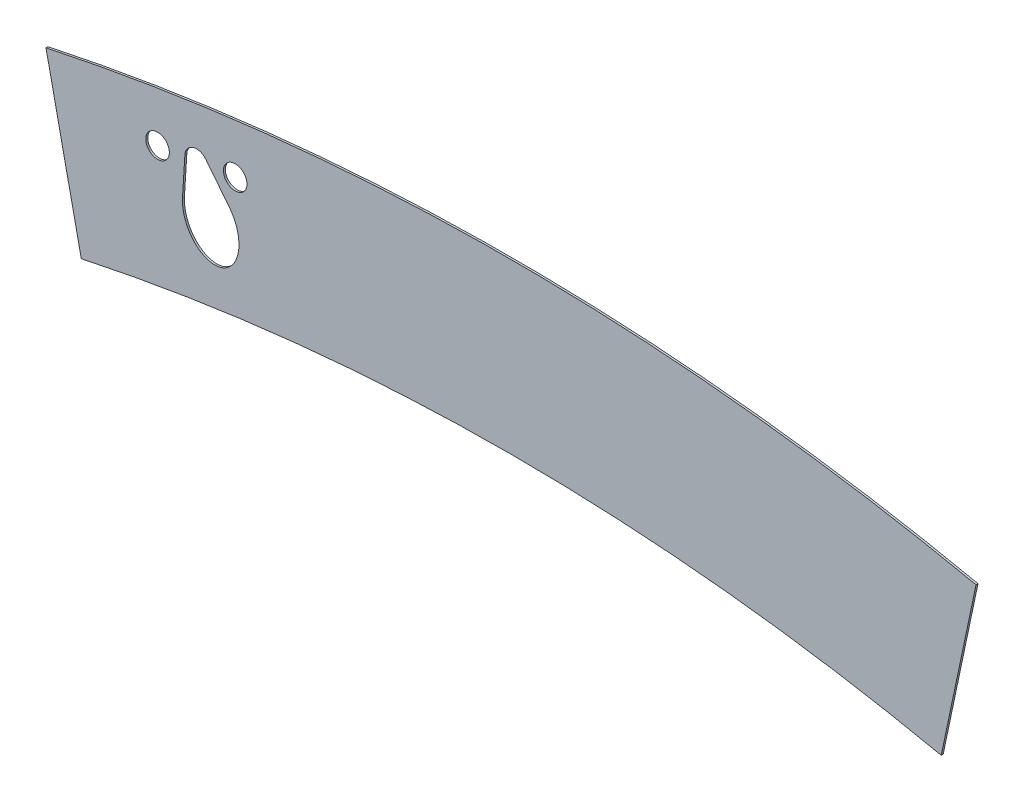
ISO-10303-21;
HEADER;
FILE_DESCRIPTION(('STEP AP214'),'2;1');
FILE_NAME('part.step','',(''),(''),'','','');
FILE_SCHEMA(('AUTOMOTIVE_DESIGN { 1 0 10303 214 1 1 1 1 }'));
ENDSEC;
DATA;
#1=APPLICATION_CONTEXT('core data for automotive mechanical design processes');
#2=APPLICATION_PROTOCOL_DEFINITION('international standard','automotive_design',2000,#1);
#3=PRODUCT_CONTEXT('',#1,'mechanical');
#4=PRODUCT('Part','Part','',(#3));
#5=PRODUCT_RELATED_PRODUCT_CATEGORY('part','',(#4));
#6=PRODUCT_DEFINITION_FORMATION('','',#4);
#7=PRODUCT_DEFINITION_CONTEXT('part definition',#1,'design');
#8=PRODUCT_DEFINITION('design','',#6,#7);
#9=PRODUCT_DEFINITION_SHAPE('','',#8);
#10=(LENGTH_UNIT() NAMED_UNIT(*) SI_UNIT(.MILLI.,.METRE.));
#11=(NAMED_UNIT(*) PLANE_ANGLE_UNIT() SI_UNIT($,.RADIAN.));
#12=(NAMED_UNIT(*) SI_UNIT($,.STERADIAN.) SOLID_ANGLE_UNIT());
#13=UNCERTAINTY_MEASURE_WITH_UNIT(LENGTH_MEASURE(1.E-05),#10,'distance_accuracy_value','');
#14=(GEOMETRIC_REPRESENTATION_CONTEXT(3) GLOBAL_UNCERTAINTY_ASSIGNED_CONTEXT((#13)) GLOBAL_UNIT_ASSIGNED_CONTEXT((#10,
#11,#12)) REPRESENTATION_CONTEXT('',''));
#15=CARTESIAN_POINT('',(0.,0.,0.));
#16=DIRECTION('',(0.,0.,1.));
#17=DIRECTION('',(1.,0.,0.));
#18=AXIS2_PLACEMENT_3D('',#15,#16,#17);
#19=CARTESIAN_POINT('',(1.09870641149543E-12,-3588.766,-3.175));
#20=DIRECTION('',(0.,0.,1.));
#21=DIRECTION('',(1.,0.,0.));
#22=AXIS2_PLACEMENT_3D('',#19,#20,#21);
#23=CYLINDRICAL_SURFACE('',#22,3588.766);
#24=CARTESIAN_POINT('',(1.09870641149543E-12,-3588.766,0.));
#25=DIRECTION('',(0.,0.,1.));
#26=DIRECTION('',(1.,0.,0.));
#27=AXIS2_PLACEMENT_3D('',#24,#25,#26);
#28=CIRCLE('',#27,3588.766);
#29=CARTESIAN_POINT('',(752.475,-79.7742962293858,0.));
#30=VERTEX_POINT('',#29);
#31=CARTESIAN_POINT('',(-752.475,-79.774296229386,0.));
#32=VERTEX_POINT('',#31);
#33=EDGE_CURVE('E172',#30,#32,#28,.T.);
#34=ORIENTED_EDGE('',*,*,#33,.F.);
#35=DIRECTION('',(0.,0.,1.));
#36=VECTOR('',#35,1.);
#37=CARTESIAN_POINT('',(752.475,-79.7742962293858,-3.175));
#38=LINE('',#37,#36);
#39=CARTESIAN_POINT('',(752.475,-79.7742962293858,-3.175));
#40=VERTEX_POINT('',#39);
#41=EDGE_CURVE('E11',#40,#30,#38,.T.);
#42=ORIENTED_EDGE('',*,*,#41,.F.);
#43=CARTESIAN_POINT('',(1.09870641149543E-12,-3588.766,-3.175));
#44=DIRECTION('',(0.,0.,1.));
#45=DIRECTION('',(1.,0.,0.));
#46=AXIS2_PLACEMENT_3D('',#43,#44,#45);
#47=CIRCLE('',#46,3588.766);
#48=CARTESIAN_POINT('',(-752.475,-79.774296229386,-3.175));
#49=VERTEX_POINT('',#48);
#50=EDGE_CURVE('E186',#40,#49,#47,.T.);
#51=ORIENTED_EDGE('',*,*,#50,.T.);
#52=DIRECTION('',(0.,0.,1.));
#53=VECTOR('',#52,1.);
#54=CARTESIAN_POINT('',(-752.475,-79.774296229386,-3.175));
#55=LINE('',#54,#53);
#56=EDGE_CURVE('E35',#49,#32,#55,.T.);
#57=ORIENTED_EDGE('',*,*,#56,.T.);
#58=EDGE_LOOP('',(#34,#42,#51,#57));
#59=FACE_BOUND('',#58,.T.);
#60=ADVANCED_FACE('F32',(#59),#23,.T.);
#61=CARTESIAN_POINT('',(752.475,-79.7742962293858,-3.175));
#62=DIRECTION('',(0.978464036765705,-0.206417365442351,0.));
#63=DIRECTION('',(0.206417365442351,0.978464036765705,0.));
#64=AXIS2_PLACEMENT_3D('',#61,#62,#63);
#65=PLANE('',#64);
#66=DIRECTION('',(0.206417365442351,0.978464036765705,0.));
#67=VECTOR('',#66,1.);
#68=CARTESIAN_POINT('',(752.475,-79.7742962293858,0.));
#69=LINE('',#68,#67);
#70=CARTESIAN_POINT('',(696.1124,-346.945505397894,0.));
#71=VERTEX_POINT('',#70);
#72=EDGE_CURVE('E183',#71,#30,#69,.T.);
#73=ORIENTED_EDGE('',*,*,#72,.F.);
#74=DIRECTION('',(0.,0.,1.));
#75=VECTOR('',#74,1.);
#76=CARTESIAN_POINT('',(696.1124,-346.945505397894,-3.175));
#77=LINE('',#76,#75);
#78=CARTESIAN_POINT('',(696.1124,-346.945505397894,-3.175));
#79=VERTEX_POINT('',#78);
#80=EDGE_CURVE('E40',#79,#71,#77,.T.);
#81=ORIENTED_EDGE('',*,*,#80,.F.);
#82=DIRECTION('',(0.206417365442351,0.978464036765705,0.));
#83=VECTOR('',#82,1.);
#84=CARTESIAN_POINT('',(752.475,-79.7742962293858,-3.175));
#85=LINE('',#84,#83);
#86=EDGE_CURVE('E198',#79,#40,#85,.T.);
#87=ORIENTED_EDGE('',*,*,#86,.T.);
#88=ORIENTED_EDGE('',*,*,#41,.T.);
#89=EDGE_LOOP('',(#73,#81,#87,#88));
#90=FACE_BOUND('',#89,.T.);
#91=ADVANCED_FACE('F154',(#90),#65,.T.);
#92=CARTESIAN_POINT('',(1.09870641149543E-12,-3588.766,-3.175));
#93=DIRECTION('',(0.,0.,1.));
#94=DIRECTION('',(1.,0.,0.));
#95=AXIS2_PLACEMENT_3D('',#92,#93,#94);
#96=CYLINDRICAL_SURFACE('',#95,3315.716);
#97=CARTESIAN_POINT('',(1.09870641149543E-12,-3588.766,0.));
#98=DIRECTION('',(0.,0.,-1.));
#99=DIRECTION('',(1.,0.,0.));
#100=AXIS2_PLACEMENT_3D('',#97,#98,#99);
#101=CIRCLE('',#100,3315.716);
#102=CARTESIAN_POINT('',(-695.3504,-346.781975690836,0.));
#103=VERTEX_POINT('',#102);
#104=EDGE_CURVE('E185',#103,#71,#101,.T.);
#105=ORIENTED_EDGE('',*,*,#104,.F.);
#106=DIRECTION('',(0.,0.,1.));
#107=VECTOR('',#106,1.);
#108=CARTESIAN_POINT('',(-695.3504,-346.781975690836,-3.175));
#109=LINE('',#108,#107);
#110=CARTESIAN_POINT('',(-695.3504,-346.781975690836,-3.175));
#111=VERTEX_POINT('',#110);
#112=EDGE_CURVE('E201',#111,#103,#109,.T.);
#113=ORIENTED_EDGE('',*,*,#112,.F.);
#114=CARTESIAN_POINT('',(1.09870641149543E-12,-3588.766,-3.175));
#115=DIRECTION('',(0.,0.,-1.));
#116=DIRECTION('',(1.,0.,0.));
#117=AXIS2_PLACEMENT_3D('',#114,#115,#116);
#118=CIRCLE('',#117,3315.716);
#119=EDGE_CURVE('E195',#111,#79,#118,.T.);
#120=ORIENTED_EDGE('',*,*,#119,.T.);
#121=ORIENTED_EDGE('',*,*,#80,.T.);
#122=EDGE_LOOP('',(#105,#113,#120,#121));
#123=FACE_BOUND('',#122,.T.);
#124=ADVANCED_FACE('F157',(#123),#96,.F.);
#125=CARTESIAN_POINT('',(-752.475,-79.774296229386,-3.175));
#126=DIRECTION('',(-0.977870890543958,-0.209209276626938,0.));
#127=DIRECTION('',(0.209209276626938,-0.977870890543958,0.));
#128=AXIS2_PLACEMENT_3D('',#125,#126,#127);
#129=PLANE('',#128);
#130=DIRECTION('',(0.209209276626938,-0.977870890543958,0.));
#131=VECTOR('',#130,1.);
#132=CARTESIAN_POINT('',(-752.475,-79.774296229386,0.));
#133=LINE('',#132,#131);
#134=EDGE_CURVE('E178',#32,#103,#133,.T.);
#135=ORIENTED_EDGE('',*,*,#134,.F.);
#136=ORIENTED_EDGE('',*,*,#56,.F.);
#137=DIRECTION('',(0.209209276626938,-0.977870890543958,0.));
#138=VECTOR('',#137,1.);
#139=CARTESIAN_POINT('',(-752.475,-79.774296229386,-3.175));
#140=LINE('',#139,#138);
#141=EDGE_CURVE('E188',#49,#111,#140,.T.);
#142=ORIENTED_EDGE('',*,*,#141,.T.);
#143=ORIENTED_EDGE('',*,*,#112,.T.);
#144=EDGE_LOOP('',(#135,#136,#142,#143));
#145=FACE_BOUND('',#144,.T.);
#146=ADVANCED_FACE('F152',(#145),#129,.T.);
#147=CARTESIAN_POINT('',(1.09870641149543E-12,-3588.766,-3.175));
#148=DIRECTION('',(0.,0.,1.));
#149=DIRECTION('',(1.,0.,0.));
#150=AXIS2_PLACEMENT_3D('',#147,#148,#149);
#151=PLANE('',#150);
#152=DIRECTION('',(-0.619708249389502,0.784832265926038,0.));
#153=VECTOR('',#152,1.);
#154=CARTESIAN_POINT('',(-493.804376520394,-106.841132271835,-3.175));
#155=LINE('',#154,#153);
#156=CARTESIAN_POINT('',(-455.462578203936,-155.399273109931,-3.175));
#157=VERTEX_POINT('',#156);
#158=CARTESIAN_POINT('',(-493.804376520394,-106.841132271835,-3.175));
#159=VERTEX_POINT('',#158);
#160=EDGE_CURVE('E127',#157,#159,#155,.T.);
#161=ORIENTED_EDGE('',*,*,#160,.T.);
#162=CARTESIAN_POINT('',(-508.755431186285,-118.646574422705,-3.175));
#163=DIRECTION('',(0.,0.,1.));
#164=DIRECTION('',(1.,0.,0.));
#165=AXIS2_PLACEMENT_3D('',#162,#163,#164);
#166=CIRCLE('',#165,19.0499999999999);
#167=CARTESIAN_POINT('',(-527.768777414876,-117.465403312439,-3.175));
#168=VERTEX_POINT('',#167);
#169=EDGE_CURVE('E117',#159,#168,#166,.T.);
#170=ORIENTED_EDGE('',*,*,#169,.T.);
#171=DIRECTION('',(-0.0620037328223592,-0.998075917511335,0.));
#172=VECTOR('',#171,1.);
#173=CARTESIAN_POINT('',(-527.768777414876,-117.465403312439,-3.175));
#174=LINE('',#173,#172);
#175=CARTESIAN_POINT('',(-531.604993281107,-179.217083351285,-3.175));
#176=VERTEX_POINT('',#175);
#177=EDGE_CURVE('E123',#168,#176,#174,.T.);
#178=ORIENTED_EDGE('',*,*,#177,.T.);
#179=CARTESIAN_POINT('',(-486.006598435166,-191.371608685066,-3.175));
#180=DIRECTION('',(0.,0.,1.));
#181=DIRECTION('',(-0.298541112219415,0.954396775096602,0.));
#182=AXIS2_PLACEMENT_3D('',#179,#180,#181);
#183=ELLIPSE('',#182,57.15,44.4499999999999);
#184=EDGE_CURVE('E48',#176,#157,#183,.T.);
#185=ORIENTED_EDGE('',*,*,#184,.T.);
#186=EDGE_LOOP('',(#161,#170,#178,#185));
#187=FACE_BOUND('',#186,.T.);
#188=CARTESIAN_POINT('',(-571.9318,-126.7714,-3.175));
#189=DIRECTION('',(0.,0.,1.));
#190=DIRECTION('',(1.,0.,0.));
#191=AXIS2_PLACEMENT_3D('',#188,#189,#190);
#192=CIRCLE('',#191,19.05);
#193=CARTESIAN_POINT('',(-552.8818,-126.7714,-3.175));
#194=VERTEX_POINT('',#193);
#195=EDGE_CURVE('E210',#194,#194,#192,.T.);
#196=ORIENTED_EDGE('',*,*,#195,.T.);
#197=EDGE_LOOP('',(#196));
#198=FACE_BOUND('',#197,.T.);
#199=CARTESIAN_POINT('',(-446.3034,-108.204,-3.175));
#200=DIRECTION('',(0.,0.,1.));
#201=DIRECTION('',(1.,0.,0.));
#202=AXIS2_PLACEMENT_3D('',#199,#200,#201);
#203=CIRCLE('',#202,19.05);
#204=CARTESIAN_POINT('',(-427.2534,-108.204,-3.175));
#205=VERTEX_POINT('',#204);
#206=EDGE_CURVE('E179',#205,#205,#203,.T.);
#207=ORIENTED_EDGE('',*,*,#206,.T.);
#208=EDGE_LOOP('',(#207));
#209=FACE_BOUND('',#208,.T.);
#210=ORIENTED_EDGE('',*,*,#50,.F.);
#211=ORIENTED_EDGE('',*,*,#86,.F.);
#212=ORIENTED_EDGE('',*,*,#119,.F.);
#213=ORIENTED_EDGE('',*,*,#141,.F.);
#214=EDGE_LOOP('',(#210,#211,#212,#213));
#215=FACE_BOUND('',#214,.T.);
#216=ADVANCED_FACE('F149',(#187,#198,#209,#215),#151,.F.);
#217=CARTESIAN_POINT('',(1.09870641149543E-12,-3588.766,0.));
#218=DIRECTION('',(0.,0.,1.));
#219=DIRECTION('',(1.,0.,0.));
#220=AXIS2_PLACEMENT_3D('',#217,#218,#219);
#221=PLANE('',#220);
#222=CARTESIAN_POINT('',(-508.755431186285,-118.646574422705,0.));
#223=DIRECTION('',(0.,0.,1.));
#224=DIRECTION('',(1.,0.,0.));
#225=AXIS2_PLACEMENT_3D('',#222,#223,#224);
#226=CIRCLE('',#225,19.0499999999999);
#227=CARTESIAN_POINT('',(-493.804376520394,-106.841132271835,0.));
#228=VERTEX_POINT('',#227);
#229=CARTESIAN_POINT('',(-527.768777414876,-117.46540331244,0.));
#230=VERTEX_POINT('',#229);
#231=EDGE_CURVE('E56',#228,#230,#226,.T.);
#232=ORIENTED_EDGE('',*,*,#231,.F.);
#233=DIRECTION('',(-0.619708249389502,0.784832265926038,0.));
#234=VECTOR('',#233,1.);
#235=CARTESIAN_POINT('',(-493.804376520394,-106.841132271835,0.));
#236=LINE('',#235,#234);
#237=CARTESIAN_POINT('',(-455.462578203936,-155.399273109931,0.));
#238=VERTEX_POINT('',#237);
#239=EDGE_CURVE('E115',#238,#228,#236,.T.);
#240=ORIENTED_EDGE('',*,*,#239,.F.);
#241=CARTESIAN_POINT('',(-486.006598435166,-191.371608685066,0.));
#242=DIRECTION('',(0.,0.,1.));
#243=DIRECTION('',(-0.298541112219415,0.954396775096602,0.));
#244=AXIS2_PLACEMENT_3D('',#241,#242,#243);
#245=ELLIPSE('',#244,57.15,44.4499999999999);
#246=CARTESIAN_POINT('',(-531.604993281107,-179.217083351286,0.));
#247=VERTEX_POINT('',#246);
#248=EDGE_CURVE('E99',#247,#238,#245,.T.);
#249=ORIENTED_EDGE('',*,*,#248,.F.);
#250=DIRECTION('',(-0.0620037328223592,-0.998075917511335,0.));
#251=VECTOR('',#250,1.);
#252=CARTESIAN_POINT('',(-527.768777414876,-117.465403312439,0.));
#253=LINE('',#252,#251);
#254=EDGE_CURVE('E108',#230,#247,#253,.T.);
#255=ORIENTED_EDGE('',*,*,#254,.F.);
#256=EDGE_LOOP('',(#232,#240,#249,#255));
#257=FACE_BOUND('',#256,.T.);
#258=CARTESIAN_POINT('',(-571.9318,-126.7714,0.));
#259=DIRECTION('',(0.,0.,1.));
#260=DIRECTION('',(1.,0.,0.));
#261=AXIS2_PLACEMENT_3D('',#258,#259,#260);
#262=CIRCLE('',#261,19.05);
#263=CARTESIAN_POINT('',(-552.8818,-126.7714,0.));
#264=VERTEX_POINT('',#263);
#265=EDGE_CURVE('E213',#264,#264,#262,.T.);
#266=ORIENTED_EDGE('',*,*,#265,.F.);
#267=EDGE_LOOP('',(#266));
#268=FACE_BOUND('',#267,.T.);
#269=CARTESIAN_POINT('',(-446.3034,-108.204,0.));
#270=DIRECTION('',(0.,0.,1.));
#271=DIRECTION('',(1.,0.,0.));
#272=AXIS2_PLACEMENT_3D('',#269,#270,#271);
#273=CIRCLE('',#272,19.05);
#274=CARTESIAN_POINT('',(-427.2534,-108.204,0.));
#275=VERTEX_POINT('',#274);
#276=EDGE_CURVE('E207',#275,#275,#273,.T.);
#277=ORIENTED_EDGE('',*,*,#276,.F.);
#278=EDGE_LOOP('',(#277));
#279=FACE_BOUND('',#278,.T.);
#280=ORIENTED_EDGE('',*,*,#33,.T.);
#281=ORIENTED_EDGE('',*,*,#134,.T.);
#282=ORIENTED_EDGE('',*,*,#104,.T.);
#283=ORIENTED_EDGE('',*,*,#72,.T.);
#284=EDGE_LOOP('',(#280,#281,#282,#283));
#285=FACE_BOUND('',#284,.T.);
#286=ADVANCED_FACE('F112',(#257,#268,#279,#285),#221,.T.);
#287=CARTESIAN_POINT('',(-446.3034,-108.204,-3.175));
#288=DIRECTION('',(0.,0.,1.));
#289=DIRECTION('',(1.,0.,0.));
#290=AXIS2_PLACEMENT_3D('',#287,#288,#289);
#291=CYLINDRICAL_SURFACE('',#290,19.05);
#292=ORIENTED_EDGE('',*,*,#206,.F.);
#293=EDGE_LOOP('',(#292));
#294=FACE_BOUND('',#293,.T.);
#295=ORIENTED_EDGE('',*,*,#276,.T.);
#296=EDGE_LOOP('',(#295));
#297=FACE_BOUND('',#296,.T.);
#298=ADVANCED_FACE('F142',(#294,#297),#291,.F.);
#299=CARTESIAN_POINT('',(-571.9318,-126.7714,-3.175));
#300=DIRECTION('',(0.,0.,1.));
#301=DIRECTION('',(1.,0.,0.));
#302=AXIS2_PLACEMENT_3D('',#299,#300,#301);
#303=CYLINDRICAL_SURFACE('',#302,19.05);
#304=ORIENTED_EDGE('',*,*,#195,.F.);
#305=EDGE_LOOP('',(#304));
#306=FACE_BOUND('',#305,.T.);
#307=ORIENTED_EDGE('',*,*,#265,.T.);
#308=EDGE_LOOP('',(#307));
#309=FACE_BOUND('',#308,.T.);
#310=ADVANCED_FACE('F139',(#306,#309),#303,.F.);
#311=CARTESIAN_POINT('',(-508.755431186285,-118.646574422705,-3.175));
#312=DIRECTION('',(0.,0.,1.));
#313=DIRECTION('',(1.,0.,0.));
#314=AXIS2_PLACEMENT_3D('',#311,#312,#313);
#315=CYLINDRICAL_SURFACE('',#314,19.0499999999999);
#316=ORIENTED_EDGE('',*,*,#231,.T.);
#317=DIRECTION('',(0.,0.,1.));
#318=VECTOR('',#317,1.);
#319=CARTESIAN_POINT('',(-527.768777414876,-117.465403312439,-3.175));
#320=LINE('',#319,#318);
#321=EDGE_CURVE('E105',#168,#230,#320,.T.);
#322=ORIENTED_EDGE('',*,*,#321,.F.);
#323=ORIENTED_EDGE('',*,*,#169,.F.);
#324=DIRECTION('',(0.,0.,1.));
#325=VECTOR('',#324,1.);
#326=CARTESIAN_POINT('',(-493.804376520394,-106.841132271835,-3.175));
#327=LINE('',#326,#325);
#328=EDGE_CURVE('E216',#159,#228,#327,.T.);
#329=ORIENTED_EDGE('',*,*,#328,.T.);
#330=EDGE_LOOP('',(#316,#322,#323,#329));
#331=FACE_BOUND('',#330,.T.);
#332=ADVANCED_FACE('F136',(#331),#315,.F.);
#333=CARTESIAN_POINT('',(-493.804376520394,-106.841132271835,-3.175));
#334=DIRECTION('',(0.784832265926038,0.619708249389502,0.));
#335=DIRECTION('',(-0.619708249389502,0.784832265926038,0.));
#336=AXIS2_PLACEMENT_3D('',#333,#334,#335);
#337=PLANE('',#336);
#338=ORIENTED_EDGE('',*,*,#239,.T.);
#339=ORIENTED_EDGE('',*,*,#328,.F.);
#340=ORIENTED_EDGE('',*,*,#160,.F.);
#341=DIRECTION('',(0.,0.,1.));
#342=VECTOR('',#341,1.);
#343=CARTESIAN_POINT('',(-455.462578203936,-155.399273109931,-3.175));
#344=LINE('',#343,#342);
#345=EDGE_CURVE('E104',#157,#238,#344,.T.);
#346=ORIENTED_EDGE('',*,*,#345,.T.);
#347=EDGE_LOOP('',(#338,#339,#340,#346));
#348=FACE_BOUND('',#347,.T.);
#349=ADVANCED_FACE('F133',(#348),#337,.F.);
#350=DIRECTION('',(0.,0.,1.));
#351=VECTOR('',#350,1.);
#352=SURFACE_OF_LINEAR_EXTRUSION('',#183,#351);
#353=ORIENTED_EDGE('',*,*,#248,.T.);
#354=ORIENTED_EDGE('',*,*,#345,.F.);
#355=ORIENTED_EDGE('',*,*,#184,.F.);
#356=DIRECTION('',(0.,0.,1.));
#357=VECTOR('',#356,1.);
#358=CARTESIAN_POINT('',(-531.604993281107,-179.217083351286,-3.175));
#359=LINE('',#358,#357);
#360=EDGE_CURVE('E95',#176,#247,#359,.T.);
#361=ORIENTED_EDGE('',*,*,#360,.T.);
#362=EDGE_LOOP('',(#353,#354,#355,#361));
#363=FACE_BOUND('',#362,.T.);
#364=ADVANCED_FACE('F97',(#363),#352,.F.);
#365=CARTESIAN_POINT('',(-527.768777414876,-117.465403312439,-3.175));
#366=DIRECTION('',(-0.998075917511335,0.0620037328223592,0.));
#367=DIRECTION('',(-0.0620037328223592,-0.998075917511335,0.));
#368=AXIS2_PLACEMENT_3D('',#365,#366,#367);
#369=PLANE('',#368);
#370=ORIENTED_EDGE('',*,*,#254,.T.);
#371=ORIENTED_EDGE('',*,*,#360,.F.);
#372=ORIENTED_EDGE('',*,*,#177,.F.);
#373=ORIENTED_EDGE('',*,*,#321,.T.);
#374=EDGE_LOOP('',(#370,#371,#372,#373));
#375=FACE_BOUND('',#374,.T.);
#376=ADVANCED_FACE('F109',(#375),#369,.F.);
#377=CLOSED_SHELL('',(#60,#91,#124,#146,#216,#286,#298,#310,#332,#349,#364,#376));
#378=MANIFOLD_SOLID_BREP('B2',#377);
#379=ADVANCED_BREP_SHAPE_REPRESENTATION('',(#18,#378),#14);
#380=SHAPE_DEFINITION_REPRESENTATION(#9,#379);
ENDSEC;
END-ISO-10303-21;
